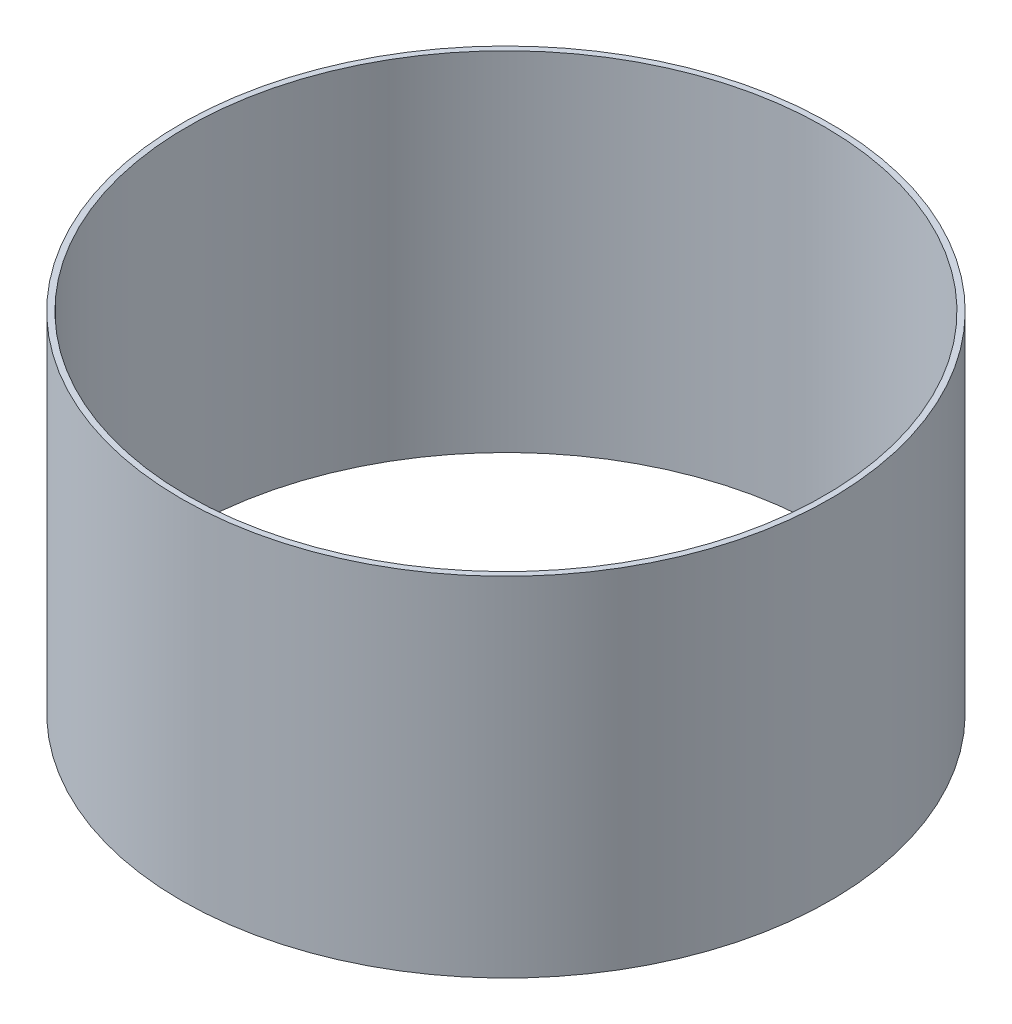
ISO-10303-21;
HEADER;
FILE_DESCRIPTION(('STEP AP214'),'2;1');
FILE_NAME('part.step','',(''),(''),'','','');
FILE_SCHEMA(('AUTOMOTIVE_DESIGN { 1 0 10303 214 1 1 1 1 }'));
ENDSEC;
DATA;
#1=APPLICATION_CONTEXT('core data for automotive mechanical design processes');
#2=APPLICATION_PROTOCOL_DEFINITION('international standard','automotive_design',2000,#1);
#3=PRODUCT_CONTEXT('',#1,'mechanical');
#4=PRODUCT('Part','Part','',(#3));
#5=PRODUCT_RELATED_PRODUCT_CATEGORY('part','',(#4));
#6=PRODUCT_DEFINITION_FORMATION('','',#4);
#7=PRODUCT_DEFINITION_CONTEXT('part definition',#1,'design');
#8=PRODUCT_DEFINITION('design','',#6,#7);
#9=PRODUCT_DEFINITION_SHAPE('','',#8);
#10=(LENGTH_UNIT() NAMED_UNIT(*) SI_UNIT(.MILLI.,.METRE.));
#11=(NAMED_UNIT(*) PLANE_ANGLE_UNIT() SI_UNIT($,.RADIAN.));
#12=(NAMED_UNIT(*) SI_UNIT($,.STERADIAN.) SOLID_ANGLE_UNIT());
#13=UNCERTAINTY_MEASURE_WITH_UNIT(LENGTH_MEASURE(1.E-05),#10,'distance_accuracy_value','');
#14=(GEOMETRIC_REPRESENTATION_CONTEXT(3) GLOBAL_UNCERTAINTY_ASSIGNED_CONTEXT((#13)) GLOBAL_UNIT_ASSIGNED_CONTEXT((#10,
#11,#12)) REPRESENTATION_CONTEXT('',''));
#15=CARTESIAN_POINT('',(0.,0.,0.));
#16=DIRECTION('',(0.,0.,1.));
#17=DIRECTION('',(1.,0.,0.));
#18=AXIS2_PLACEMENT_3D('',#15,#16,#17);
#19=CARTESIAN_POINT('',(0.,300.,0.));
#20=DIRECTION('',(0.,1.,0.));
#21=DIRECTION('',(0.,0.,1.));
#22=AXIS2_PLACEMENT_3D('',#19,#20,#21);
#23=PLANE('',#22);
#24=CARTESIAN_POINT('',(0.,300.,0.));
#25=DIRECTION('',(0.,1.,0.));
#26=DIRECTION('',(0.,0.,1.));
#27=AXIS2_PLACEMENT_3D('',#24,#25,#26);
#28=CIRCLE('',#27,280.);
#29=CARTESIAN_POINT('',(0.,300.,280.));
#30=VERTEX_POINT('',#29);
#31=EDGE_CURVE('E10',#30,#30,#28,.T.);
#32=ORIENTED_EDGE('',*,*,#31,.T.);
#33=EDGE_LOOP('',(#32));
#34=FACE_BOUND('',#33,.T.);
#35=CARTESIAN_POINT('',(0.,300.,0.));
#36=DIRECTION('',(0.,1.,0.));
#37=DIRECTION('',(0.,0.,1.));
#38=AXIS2_PLACEMENT_3D('',#35,#36,#37);
#39=CIRCLE('',#38,275.);
#40=CARTESIAN_POINT('',(0.,300.,275.));
#41=VERTEX_POINT('',#40);
#42=EDGE_CURVE('E62',#41,#41,#39,.T.);
#43=ORIENTED_EDGE('',*,*,#42,.F.);
#44=EDGE_LOOP('',(#43));
#45=FACE_BOUND('',#44,.T.);
#46=ADVANCED_FACE('F49',(#34,#45),#23,.T.);
#47=CARTESIAN_POINT('',(0.,0.,0.));
#48=DIRECTION('',(0.,1.,0.));
#49=DIRECTION('',(0.,0.,1.));
#50=AXIS2_PLACEMENT_3D('',#47,#48,#49);
#51=PLANE('',#50);
#52=CARTESIAN_POINT('',(0.,0.,0.));
#53=DIRECTION('',(0.,1.,0.));
#54=DIRECTION('',(0.,0.,1.));
#55=AXIS2_PLACEMENT_3D('',#52,#53,#54);
#56=CIRCLE('',#55,280.);
#57=CARTESIAN_POINT('',(0.,0.,280.));
#58=VERTEX_POINT('',#57);
#59=EDGE_CURVE('E53',#58,#58,#56,.T.);
#60=ORIENTED_EDGE('',*,*,#59,.F.);
#61=EDGE_LOOP('',(#60));
#62=FACE_BOUND('',#61,.T.);
#63=CARTESIAN_POINT('',(0.,0.,0.));
#64=DIRECTION('',(0.,1.,0.));
#65=DIRECTION('',(0.,0.,1.));
#66=AXIS2_PLACEMENT_3D('',#63,#64,#65);
#67=CIRCLE('',#66,275.);
#68=CARTESIAN_POINT('',(0.,0.,275.));
#69=VERTEX_POINT('',#68);
#70=EDGE_CURVE('E64',#69,#69,#67,.T.);
#71=ORIENTED_EDGE('',*,*,#70,.T.);
#72=EDGE_LOOP('',(#71));
#73=FACE_BOUND('',#72,.T.);
#74=ADVANCED_FACE('F76',(#62,#73),#51,.F.);
#75=CARTESIAN_POINT('',(0.,300.,0.));
#76=DIRECTION('',(0.,-1.,0.));
#77=DIRECTION('',(0.,0.,-1.));
#78=AXIS2_PLACEMENT_3D('',#75,#76,#77);
#79=CYLINDRICAL_SURFACE('',#78,280.);
#80=ORIENTED_EDGE('',*,*,#31,.F.);
#81=EDGE_LOOP('',(#80));
#82=FACE_BOUND('',#81,.T.);
#83=ORIENTED_EDGE('',*,*,#59,.T.);
#84=EDGE_LOOP('',(#83));
#85=FACE_BOUND('',#84,.T.);
#86=ADVANCED_FACE('F51',(#82,#85),#79,.T.);
#87=CARTESIAN_POINT('',(0.,300.,0.));
#88=DIRECTION('',(0.,-1.,0.));
#89=DIRECTION('',(0.,0.,-1.));
#90=AXIS2_PLACEMENT_3D('',#87,#88,#89);
#91=CYLINDRICAL_SURFACE('',#90,275.);
#92=ORIENTED_EDGE('',*,*,#42,.T.);
#93=EDGE_LOOP('',(#92));
#94=FACE_BOUND('',#93,.T.);
#95=ORIENTED_EDGE('',*,*,#70,.F.);
#96=EDGE_LOOP('',(#95));
#97=FACE_BOUND('',#96,.T.);
#98=ADVANCED_FACE('F72',(#94,#97),#91,.F.);
#99=CLOSED_SHELL('',(#46,#74,#86,#98));
#100=MANIFOLD_SOLID_BREP('B2',#99);
#101=ADVANCED_BREP_SHAPE_REPRESENTATION('',(#18,#100),#14);
#102=SHAPE_DEFINITION_REPRESENTATION(#9,#101);
ENDSEC;
END-ISO-10303-21;
